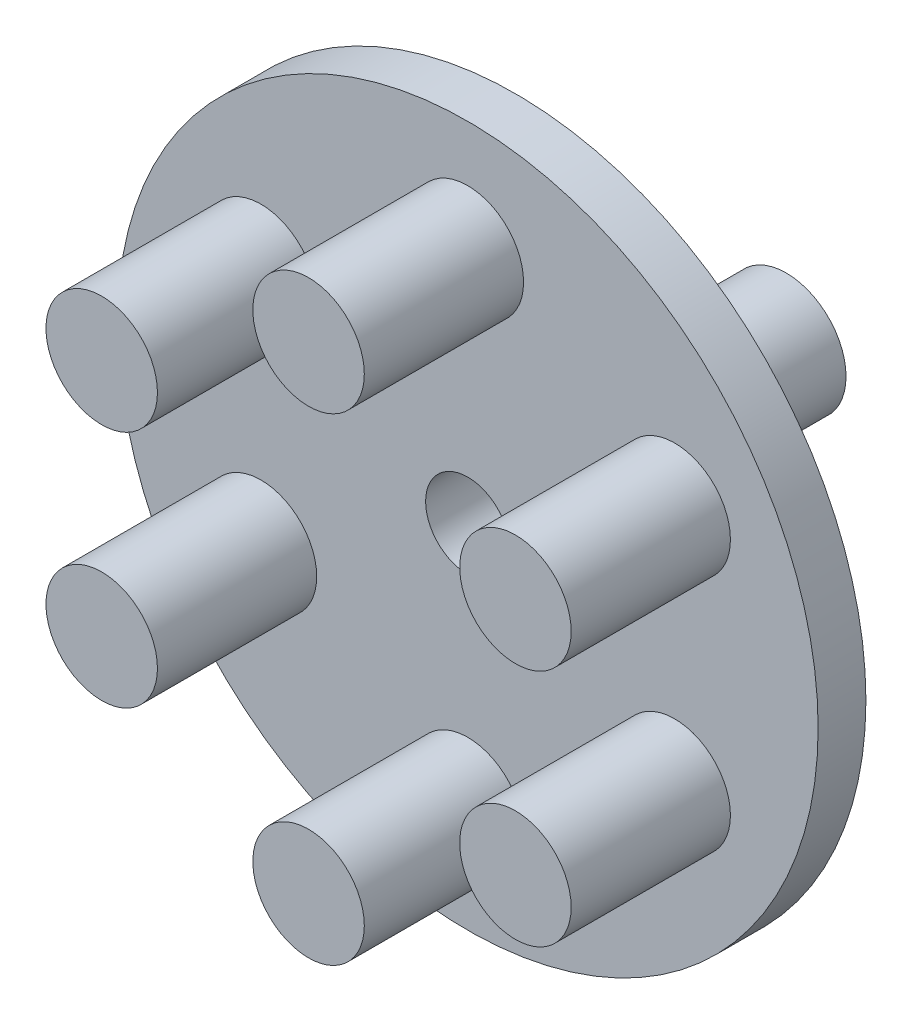
ISO-10303-21;
HEADER;
FILE_DESCRIPTION(('STEP AP214'),'2;1');
FILE_NAME('part.step','',(''),(''),'','','');
FILE_SCHEMA(('AUTOMOTIVE_DESIGN { 1 0 10303 214 1 1 1 1 }'));
ENDSEC;
DATA;
#1=APPLICATION_CONTEXT('core data for automotive mechanical design processes');
#2=APPLICATION_PROTOCOL_DEFINITION('international standard','automotive_design',2000,#1);
#3=PRODUCT_CONTEXT('',#1,'mechanical');
#4=PRODUCT('Part','Part','',(#3));
#5=PRODUCT_RELATED_PRODUCT_CATEGORY('part','',(#4));
#6=PRODUCT_DEFINITION_FORMATION('','',#4);
#7=PRODUCT_DEFINITION_CONTEXT('part definition',#1,'design');
#8=PRODUCT_DEFINITION('design','',#6,#7);
#9=PRODUCT_DEFINITION_SHAPE('','',#8);
#10=(LENGTH_UNIT() NAMED_UNIT(*) SI_UNIT(.MILLI.,.METRE.));
#11=(NAMED_UNIT(*) PLANE_ANGLE_UNIT() SI_UNIT($,.RADIAN.));
#12=(NAMED_UNIT(*) SI_UNIT($,.STERADIAN.) SOLID_ANGLE_UNIT());
#13=UNCERTAINTY_MEASURE_WITH_UNIT(LENGTH_MEASURE(1.E-05),#10,'distance_accuracy_value','');
#14=(GEOMETRIC_REPRESENTATION_CONTEXT(3) GLOBAL_UNCERTAINTY_ASSIGNED_CONTEXT((#13)) GLOBAL_UNIT_ASSIGNED_CONTEXT((#10,
#11,#12)) REPRESENTATION_CONTEXT('',''));
#15=CARTESIAN_POINT('',(0.,0.,0.));
#16=DIRECTION('',(0.,0.,1.));
#17=DIRECTION('',(1.,0.,0.));
#18=AXIS2_PLACEMENT_3D('',#15,#16,#17);
#19=CARTESIAN_POINT('',(0.,0.,0.));
#20=DIRECTION('',(0.,0.,1.));
#21=DIRECTION('',(1.,0.,0.));
#22=AXIS2_PLACEMENT_3D('',#19,#20,#21);
#23=PLANE('',#22);
#24=CARTESIAN_POINT('',(0.,0.,0.));
#25=DIRECTION('',(0.,0.,1.));
#26=DIRECTION('',(1.,0.,0.));
#27=AXIS2_PLACEMENT_3D('',#24,#25,#26);
#28=CIRCLE('',#27,22.);
#29=CARTESIAN_POINT('',(22.,0.,0.));
#30=VERTEX_POINT('',#29);
#31=EDGE_CURVE('E53',#30,#30,#28,.T.);
#32=ORIENTED_EDGE('',*,*,#31,.F.);
#33=EDGE_LOOP('',(#32));
#34=FACE_BOUND('',#33,.T.);
#35=CARTESIAN_POINT('',(0.,0.,0.));
#36=DIRECTION('',(0.,0.,1.));
#37=DIRECTION('',(1.,0.,0.));
#38=AXIS2_PLACEMENT_3D('',#35,#36,#37);
#39=CIRCLE('',#38,3.75);
#40=CARTESIAN_POINT('',(3.75,0.,0.));
#41=VERTEX_POINT('',#40);
#42=EDGE_CURVE('E10',#41,#41,#39,.F.);
#43=ORIENTED_EDGE('',*,*,#42,.F.);
#44=EDGE_LOOP('',(#43));
#45=FACE_BOUND('',#44,.T.);
#46=ADVANCED_FACE('F37',(#34,#45),#23,.F.);
#47=CARTESIAN_POINT('',(0.,0.,3.));
#48=DIRECTION('',(0.,0.,1.));
#49=DIRECTION('',(1.,0.,0.));
#50=AXIS2_PLACEMENT_3D('',#47,#48,#49);
#51=PLANE('',#50);
#52=CARTESIAN_POINT('',(0.,15.,3.));
#53=DIRECTION('',(0.,0.,1.));
#54=DIRECTION('',(1.,0.,0.));
#55=AXIS2_PLACEMENT_3D('',#52,#53,#54);
#56=CIRCLE('',#55,3.5);
#57=CARTESIAN_POINT('',(3.5,15.,3.));
#58=VERTEX_POINT('',#57);
#59=EDGE_CURVE('E154',#58,#58,#56,.T.);
#60=ORIENTED_EDGE('',*,*,#59,.F.);
#61=EDGE_LOOP('',(#60));
#62=FACE_BOUND('',#61,.T.);
#63=CARTESIAN_POINT('',(-12.9903810567665,7.50000000000015,3.));
#64=DIRECTION('',(0.,0.,1.));
#65=DIRECTION('',(1.,0.,0.));
#66=AXIS2_PLACEMENT_3D('',#63,#64,#65);
#67=CIRCLE('',#66,3.5);
#68=CARTESIAN_POINT('',(-9.49038105676649,7.50000000000015,3.));
#69=VERTEX_POINT('',#68);
#70=EDGE_CURVE('E62',#69,#69,#67,.T.);
#71=ORIENTED_EDGE('',*,*,#70,.F.);
#72=EDGE_LOOP('',(#71));
#73=FACE_BOUND('',#72,.T.);
#74=CARTESIAN_POINT('',(-1.04744440165294E-13,-15.,3.));
#75=DIRECTION('',(0.,0.,1.));
#76=DIRECTION('',(1.,0.,0.));
#77=AXIS2_PLACEMENT_3D('',#74,#75,#76);
#78=CIRCLE('',#77,3.5);
#79=CARTESIAN_POINT('',(3.49999999999989,-15.,3.));
#80=VERTEX_POINT('',#79);
#81=EDGE_CURVE('E172',#80,#80,#78,.T.);
#82=ORIENTED_EDGE('',*,*,#81,.F.);
#83=EDGE_LOOP('',(#82));
#84=FACE_BOUND('',#83,.T.);
#85=CARTESIAN_POINT('',(12.9903810567665,-7.50000000000006,3.));
#86=DIRECTION('',(0.,0.,1.));
#87=DIRECTION('',(1.,0.,0.));
#88=AXIS2_PLACEMENT_3D('',#85,#86,#87);
#89=CIRCLE('',#88,3.5);
#90=CARTESIAN_POINT('',(16.4903810567665,-7.50000000000006,3.));
#91=VERTEX_POINT('',#90);
#92=EDGE_CURVE('E167',#91,#91,#89,.T.);
#93=ORIENTED_EDGE('',*,*,#92,.F.);
#94=EDGE_LOOP('',(#93));
#95=FACE_BOUND('',#94,.T.);
#96=CARTESIAN_POINT('',(12.9903810567666,7.49999999999997,3.));
#97=DIRECTION('',(0.,0.,1.));
#98=DIRECTION('',(1.,0.,0.));
#99=AXIS2_PLACEMENT_3D('',#96,#97,#98);
#100=CIRCLE('',#99,3.5);
#101=CARTESIAN_POINT('',(16.4903810567666,7.49999999999997,3.));
#102=VERTEX_POINT('',#101);
#103=EDGE_CURVE('E157',#102,#102,#100,.T.);
#104=ORIENTED_EDGE('',*,*,#103,.F.);
#105=EDGE_LOOP('',(#104));
#106=FACE_BOUND('',#105,.T.);
#107=CARTESIAN_POINT('',(0.,0.,3.));
#108=DIRECTION('',(0.,0.,1.));
#109=DIRECTION('',(1.,0.,0.));
#110=AXIS2_PLACEMENT_3D('',#107,#108,#109);
#111=CIRCLE('',#110,22.);
#112=CARTESIAN_POINT('',(22.,0.,3.));
#113=VERTEX_POINT('',#112);
#114=EDGE_CURVE('E48',#113,#113,#111,.T.);
#115=ORIENTED_EDGE('',*,*,#114,.T.);
#116=EDGE_LOOP('',(#115));
#117=FACE_BOUND('',#116,.T.);
#118=CARTESIAN_POINT('',(0.,0.,3.));
#119=DIRECTION('',(0.,0.,1.));
#120=DIRECTION('',(1.,0.,0.));
#121=AXIS2_PLACEMENT_3D('',#118,#119,#120);
#122=CIRCLE('',#121,2.65);
#123=CARTESIAN_POINT('',(2.65,0.,3.));
#124=VERTEX_POINT('',#123);
#125=EDGE_CURVE('E63',#124,#124,#122,.T.);
#126=ORIENTED_EDGE('',*,*,#125,.F.);
#127=EDGE_LOOP('',(#126));
#128=FACE_BOUND('',#127,.T.);
#129=CARTESIAN_POINT('',(-12.9903810567667,-7.49999999999988,3.));
#130=DIRECTION('',(0.,0.,1.));
#131=DIRECTION('',(1.,0.,0.));
#132=AXIS2_PLACEMENT_3D('',#129,#130,#131);
#133=CIRCLE('',#132,3.5);
#134=CARTESIAN_POINT('',(-9.49038105676665,-7.49999999999988,3.));
#135=VERTEX_POINT('',#134);
#136=EDGE_CURVE('E44',#135,#135,#133,.T.);
#137=ORIENTED_EDGE('',*,*,#136,.F.);
#138=EDGE_LOOP('',(#137));
#139=FACE_BOUND('',#138,.T.);
#140=ADVANCED_FACE('F72',(#62,#73,#84,#95,#106,#117,#128,#139),#51,.T.);
#141=CARTESIAN_POINT('',(0.,0.,3.));
#142=DIRECTION('',(0.,0.,-1.));
#143=DIRECTION('',(-1.,0.,0.));
#144=AXIS2_PLACEMENT_3D('',#141,#142,#143);
#145=CYLINDRICAL_SURFACE('',#144,22.);
#146=ORIENTED_EDGE('',*,*,#114,.F.);
#147=EDGE_LOOP('',(#146));
#148=FACE_BOUND('',#147,.T.);
#149=ORIENTED_EDGE('',*,*,#31,.T.);
#150=EDGE_LOOP('',(#149));
#151=FACE_BOUND('',#150,.T.);
#152=ADVANCED_FACE('F39',(#148,#151),#145,.T.);
#153=CARTESIAN_POINT('',(0.,0.,3.));
#154=DIRECTION('',(0.,0.,-1.));
#155=DIRECTION('',(-1.,0.,0.));
#156=AXIS2_PLACEMENT_3D('',#153,#154,#155);
#157=CYLINDRICAL_SURFACE('',#156,2.65);
#158=ORIENTED_EDGE('',*,*,#125,.T.);
#159=EDGE_LOOP('',(#158));
#160=FACE_BOUND('',#159,.T.);
#161=CARTESIAN_POINT('',(0.,0.,-17.));
#162=DIRECTION('',(0.,0.,-1.));
#163=DIRECTION('',(-1.,0.,0.));
#164=AXIS2_PLACEMENT_3D('',#161,#162,#163);
#165=CIRCLE('',#164,2.65);
#166=CARTESIAN_POINT('',(-2.65,0.,-17.));
#167=VERTEX_POINT('',#166);
#168=EDGE_CURVE('E146',#167,#167,#165,.T.);
#169=ORIENTED_EDGE('',*,*,#168,.T.);
#170=EDGE_LOOP('',(#169));
#171=FACE_BOUND('',#170,.T.);
#172=ADVANCED_FACE('F81',(#160,#171),#157,.F.);
#173=CARTESIAN_POINT('',(12.9903810567666,7.49999999999997,13.));
#174=DIRECTION('',(0.,0.,-1.));
#175=DIRECTION('',(-1.,0.,0.));
#176=AXIS2_PLACEMENT_3D('',#173,#174,#175);
#177=CYLINDRICAL_SURFACE('',#176,3.5);
#178=CARTESIAN_POINT('',(12.9903810567666,7.49999999999997,13.));
#179=DIRECTION('',(0.,0.,1.));
#180=DIRECTION('',(1.,0.,0.));
#181=AXIS2_PLACEMENT_3D('',#178,#179,#180);
#182=CIRCLE('',#181,3.5);
#183=CARTESIAN_POINT('',(16.4903810567666,7.49999999999997,13.));
#184=VERTEX_POINT('',#183);
#185=EDGE_CURVE('E164',#184,#184,#182,.T.);
#186=ORIENTED_EDGE('',*,*,#185,.F.);
#187=EDGE_LOOP('',(#186));
#188=FACE_BOUND('',#187,.T.);
#189=ORIENTED_EDGE('',*,*,#103,.T.);
#190=EDGE_LOOP('',(#189));
#191=FACE_BOUND('',#190,.T.);
#192=ADVANCED_FACE('F83',(#188,#191),#177,.T.);
#193=CARTESIAN_POINT('',(12.9903810567666,7.49999999999997,13.));
#194=DIRECTION('',(0.,0.,1.));
#195=DIRECTION('',(1.,0.,0.));
#196=AXIS2_PLACEMENT_3D('',#193,#194,#195);
#197=PLANE('',#196);
#198=ORIENTED_EDGE('',*,*,#185,.T.);
#199=EDGE_LOOP('',(#198));
#200=FACE_BOUND('',#199,.T.);
#201=ADVANCED_FACE('F110',(#200),#197,.T.);
#202=CARTESIAN_POINT('',(12.9903810567665,-7.50000000000006,13.));
#203=DIRECTION('',(0.,0.,-1.));
#204=DIRECTION('',(-1.,0.,0.));
#205=AXIS2_PLACEMENT_3D('',#202,#203,#204);
#206=CYLINDRICAL_SURFACE('',#205,3.5);
#207=CARTESIAN_POINT('',(12.9903810567665,-7.50000000000006,13.));
#208=DIRECTION('',(0.,0.,1.));
#209=DIRECTION('',(1.,0.,0.));
#210=AXIS2_PLACEMENT_3D('',#207,#208,#209);
#211=CIRCLE('',#210,3.5);
#212=CARTESIAN_POINT('',(16.4903810567665,-7.50000000000006,13.));
#213=VERTEX_POINT('',#212);
#214=EDGE_CURVE('E170',#213,#213,#211,.T.);
#215=ORIENTED_EDGE('',*,*,#214,.F.);
#216=EDGE_LOOP('',(#215));
#217=FACE_BOUND('',#216,.T.);
#218=ORIENTED_EDGE('',*,*,#92,.T.);
#219=EDGE_LOOP('',(#218));
#220=FACE_BOUND('',#219,.T.);
#221=ADVANCED_FACE('F106',(#217,#220),#206,.T.);
#222=CARTESIAN_POINT('',(12.9903810567665,-7.50000000000006,13.));
#223=DIRECTION('',(0.,0.,1.));
#224=DIRECTION('',(1.,0.,0.));
#225=AXIS2_PLACEMENT_3D('',#222,#223,#224);
#226=PLANE('',#225);
#227=ORIENTED_EDGE('',*,*,#214,.T.);
#228=EDGE_LOOP('',(#227));
#229=FACE_BOUND('',#228,.T.);
#230=ADVANCED_FACE('F102',(#229),#226,.T.);
#231=CARTESIAN_POINT('',(-1.04744440165294E-13,-15.,13.));
#232=DIRECTION('',(0.,0.,-1.));
#233=DIRECTION('',(-1.,0.,0.));
#234=AXIS2_PLACEMENT_3D('',#231,#232,#233);
#235=CYLINDRICAL_SURFACE('',#234,3.5);
#236=CARTESIAN_POINT('',(-1.04744440165294E-13,-15.,13.));
#237=DIRECTION('',(0.,0.,1.));
#238=DIRECTION('',(1.,0.,0.));
#239=AXIS2_PLACEMENT_3D('',#236,#237,#238);
#240=CIRCLE('',#239,3.5);
#241=CARTESIAN_POINT('',(3.49999999999989,-15.,13.));
#242=VERTEX_POINT('',#241);
#243=EDGE_CURVE('E57',#242,#242,#240,.T.);
#244=ORIENTED_EDGE('',*,*,#243,.F.);
#245=EDGE_LOOP('',(#244));
#246=FACE_BOUND('',#245,.T.);
#247=ORIENTED_EDGE('',*,*,#81,.T.);
#248=EDGE_LOOP('',(#247));
#249=FACE_BOUND('',#248,.T.);
#250=ADVANCED_FACE('F98',(#246,#249),#235,.T.);
#251=CARTESIAN_POINT('',(-1.04744440165294E-13,-15.,13.));
#252=DIRECTION('',(0.,0.,1.));
#253=DIRECTION('',(1.,0.,0.));
#254=AXIS2_PLACEMENT_3D('',#251,#252,#253);
#255=PLANE('',#254);
#256=ORIENTED_EDGE('',*,*,#243,.T.);
#257=EDGE_LOOP('',(#256));
#258=FACE_BOUND('',#257,.T.);
#259=ADVANCED_FACE('F94',(#258),#255,.T.);
#260=CARTESIAN_POINT('',(-12.9903810567665,7.50000000000015,13.));
#261=DIRECTION('',(0.,0.,-1.));
#262=DIRECTION('',(-1.,0.,0.));
#263=AXIS2_PLACEMENT_3D('',#260,#261,#262);
#264=CYLINDRICAL_SURFACE('',#263,3.5);
#265=CARTESIAN_POINT('',(-12.9903810567665,7.50000000000015,13.));
#266=DIRECTION('',(0.,0.,1.));
#267=DIRECTION('',(1.,0.,0.));
#268=AXIS2_PLACEMENT_3D('',#265,#266,#267);
#269=CIRCLE('',#268,3.5);
#270=CARTESIAN_POINT('',(-9.49038105676649,7.50000000000015,13.));
#271=VERTEX_POINT('',#270);
#272=EDGE_CURVE('E149',#271,#271,#269,.T.);
#273=ORIENTED_EDGE('',*,*,#272,.F.);
#274=EDGE_LOOP('',(#273));
#275=FACE_BOUND('',#274,.T.);
#276=ORIENTED_EDGE('',*,*,#70,.T.);
#277=EDGE_LOOP('',(#276));
#278=FACE_BOUND('',#277,.T.);
#279=ADVANCED_FACE('F97',(#275,#278),#264,.T.);
#280=CARTESIAN_POINT('',(-12.9903810567665,7.50000000000015,13.));
#281=DIRECTION('',(0.,0.,1.));
#282=DIRECTION('',(1.,0.,0.));
#283=AXIS2_PLACEMENT_3D('',#280,#281,#282);
#284=PLANE('',#283);
#285=ORIENTED_EDGE('',*,*,#272,.T.);
#286=EDGE_LOOP('',(#285));
#287=FACE_BOUND('',#286,.T.);
#288=ADVANCED_FACE('F118',(#287),#284,.T.);
#289=CARTESIAN_POINT('',(0.,15.,13.));
#290=DIRECTION('',(0.,0.,-1.));
#291=DIRECTION('',(-1.,0.,0.));
#292=AXIS2_PLACEMENT_3D('',#289,#290,#291);
#293=CYLINDRICAL_SURFACE('',#292,3.5);
#294=CARTESIAN_POINT('',(0.,15.,13.));
#295=DIRECTION('',(0.,0.,1.));
#296=DIRECTION('',(1.,0.,0.));
#297=AXIS2_PLACEMENT_3D('',#294,#295,#296);
#298=CIRCLE('',#297,3.5);
#299=CARTESIAN_POINT('',(3.5,15.,13.));
#300=VERTEX_POINT('',#299);
#301=EDGE_CURVE('E65',#300,#300,#298,.T.);
#302=ORIENTED_EDGE('',*,*,#301,.F.);
#303=EDGE_LOOP('',(#302));
#304=FACE_BOUND('',#303,.T.);
#305=ORIENTED_EDGE('',*,*,#59,.T.);
#306=EDGE_LOOP('',(#305));
#307=FACE_BOUND('',#306,.T.);
#308=ADVANCED_FACE('F121',(#304,#307),#293,.T.);
#309=CARTESIAN_POINT('',(0.,15.,13.));
#310=DIRECTION('',(0.,0.,1.));
#311=DIRECTION('',(1.,0.,0.));
#312=AXIS2_PLACEMENT_3D('',#309,#310,#311);
#313=PLANE('',#312);
#314=ORIENTED_EDGE('',*,*,#301,.T.);
#315=EDGE_LOOP('',(#314));
#316=FACE_BOUND('',#315,.T.);
#317=ADVANCED_FACE('F92',(#316),#313,.T.);
#318=CARTESIAN_POINT('',(-12.9903810567667,-7.49999999999988,13.));
#319=DIRECTION('',(0.,0.,-1.));
#320=DIRECTION('',(-1.,0.,0.));
#321=AXIS2_PLACEMENT_3D('',#318,#319,#320);
#322=CYLINDRICAL_SURFACE('',#321,3.5);
#323=CARTESIAN_POINT('',(-12.9903810567667,-7.49999999999988,13.));
#324=DIRECTION('',(0.,0.,1.));
#325=DIRECTION('',(1.,0.,0.));
#326=AXIS2_PLACEMENT_3D('',#323,#324,#325);
#327=CIRCLE('',#326,3.5);
#328=CARTESIAN_POINT('',(-9.49038105676665,-7.49999999999988,13.));
#329=VERTEX_POINT('',#328);
#330=EDGE_CURVE('E59',#329,#329,#327,.T.);
#331=ORIENTED_EDGE('',*,*,#330,.F.);
#332=EDGE_LOOP('',(#331));
#333=FACE_BOUND('',#332,.T.);
#334=ORIENTED_EDGE('',*,*,#136,.T.);
#335=EDGE_LOOP('',(#334));
#336=FACE_BOUND('',#335,.T.);
#337=ADVANCED_FACE('F88',(#333,#336),#322,.T.);
#338=CARTESIAN_POINT('',(-12.9903810567667,-7.49999999999988,13.));
#339=DIRECTION('',(0.,0.,1.));
#340=DIRECTION('',(1.,0.,0.));
#341=AXIS2_PLACEMENT_3D('',#338,#339,#340);
#342=PLANE('',#341);
#343=ORIENTED_EDGE('',*,*,#330,.T.);
#344=EDGE_LOOP('',(#343));
#345=FACE_BOUND('',#344,.T.);
#346=ADVANCED_FACE('F85',(#345),#342,.T.);
#347=CARTESIAN_POINT('',(0.,0.,-17.));
#348=DIRECTION('',(0.,0.,-1.));
#349=DIRECTION('',(-1.,0.,0.));
#350=AXIS2_PLACEMENT_3D('',#347,#348,#349);
#351=PLANE('',#350);
#352=CARTESIAN_POINT('',(0.,0.,-17.));
#353=DIRECTION('',(0.,0.,-1.));
#354=DIRECTION('',(-1.,0.,0.));
#355=AXIS2_PLACEMENT_3D('',#352,#353,#354);
#356=CIRCLE('',#355,3.75);
#357=CARTESIAN_POINT('',(-3.75,0.,-17.));
#358=VERTEX_POINT('',#357);
#359=EDGE_CURVE('E143',#358,#358,#356,.T.);
#360=ORIENTED_EDGE('',*,*,#359,.T.);
#361=EDGE_LOOP('',(#360));
#362=FACE_BOUND('',#361,.T.);
#363=ORIENTED_EDGE('',*,*,#168,.F.);
#364=EDGE_LOOP('',(#363));
#365=FACE_BOUND('',#364,.T.);
#366=ADVANCED_FACE('F87',(#362,#365),#351,.T.);
#367=CARTESIAN_POINT('',(0.,0.,-17.));
#368=DIRECTION('',(0.,0.,1.));
#369=DIRECTION('',(1.,0.,0.));
#370=AXIS2_PLACEMENT_3D('',#367,#368,#369);
#371=CYLINDRICAL_SURFACE('',#370,3.75);
#372=ORIENTED_EDGE('',*,*,#359,.F.);
#373=EDGE_LOOP('',(#372));
#374=FACE_BOUND('',#373,.T.);
#375=ORIENTED_EDGE('',*,*,#42,.T.);
#376=EDGE_LOOP('',(#375));
#377=FACE_BOUND('',#376,.T.);
#378=ADVANCED_FACE('F132',(#374,#377),#371,.T.);
#379=CLOSED_SHELL('',(#46,#140,#152,#172,#192,#201,#221,#230,#250,#259,#279,#288,#308,#317,#337,
#346,#366,#378));
#380=MANIFOLD_SOLID_BREP('B2',#379);
#381=ADVANCED_BREP_SHAPE_REPRESENTATION('',(#18,#380),#14);
#382=SHAPE_DEFINITION_REPRESENTATION(#9,#381);
ENDSEC;
END-ISO-10303-21;
